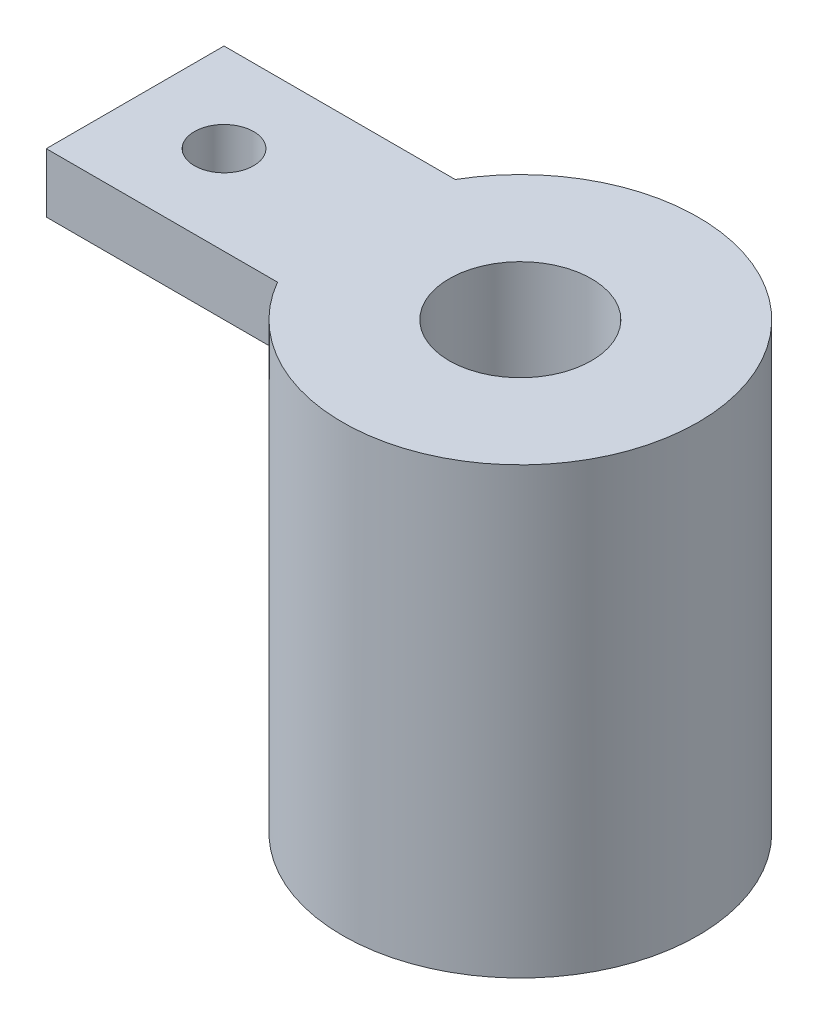
ISO-10303-21;
HEADER;
FILE_DESCRIPTION(('STEP AP214'),'2;1');
FILE_NAME('part.step','',(''),(''),'','','');
FILE_SCHEMA(('AUTOMOTIVE_DESIGN { 1 0 10303 214 1 1 1 1 }'));
ENDSEC;
DATA;
#1=APPLICATION_CONTEXT('core data for automotive mechanical design processes');
#2=APPLICATION_PROTOCOL_DEFINITION('international standard','automotive_design',2000,#1);
#3=PRODUCT_CONTEXT('',#1,'mechanical');
#4=PRODUCT('Part','Part','',(#3));
#5=PRODUCT_RELATED_PRODUCT_CATEGORY('part','',(#4));
#6=PRODUCT_DEFINITION_FORMATION('','',#4);
#7=PRODUCT_DEFINITION_CONTEXT('part definition',#1,'design');
#8=PRODUCT_DEFINITION('design','',#6,#7);
#9=PRODUCT_DEFINITION_SHAPE('','',#8);
#10=(LENGTH_UNIT() NAMED_UNIT(*) SI_UNIT(.MILLI.,.METRE.));
#11=(NAMED_UNIT(*) PLANE_ANGLE_UNIT() SI_UNIT($,.RADIAN.));
#12=(NAMED_UNIT(*) SI_UNIT($,.STERADIAN.) SOLID_ANGLE_UNIT());
#13=UNCERTAINTY_MEASURE_WITH_UNIT(LENGTH_MEASURE(1.E-05),#10,'distance_accuracy_value','');
#14=(GEOMETRIC_REPRESENTATION_CONTEXT(3) GLOBAL_UNCERTAINTY_ASSIGNED_CONTEXT((#13)) GLOBAL_UNIT_ASSIGNED_CONTEXT((#10,
#11,#12)) REPRESENTATION_CONTEXT('',''));
#15=CARTESIAN_POINT('',(0.,0.,0.));
#16=DIRECTION('',(0.,0.,1.));
#17=DIRECTION('',(1.,0.,0.));
#18=AXIS2_PLACEMENT_3D('',#15,#16,#17);
#19=CARTESIAN_POINT('',(0.,12.7,0.));
#20=DIRECTION('',(0.,1.,0.));
#21=DIRECTION('',(0.,0.,1.));
#22=AXIS2_PLACEMENT_3D('',#19,#20,#21);
#23=PLANE('',#22);
#24=CARTESIAN_POINT('',(0.,12.7,0.));
#25=DIRECTION('',(0.,1.,0.));
#26=DIRECTION('',(0.,0.,1.));
#27=AXIS2_PLACEMENT_3D('',#24,#25,#26);
#28=CIRCLE('',#27,9.525);
#29=CARTESIAN_POINT('',(0.,12.7,9.525));
#30=VERTEX_POINT('',#29);
#31=EDGE_CURVE('E175',#30,#30,#28,.T.);
#32=ORIENTED_EDGE('',*,*,#31,.F.);
#33=EDGE_LOOP('',(#32));
#34=FACE_BOUND('',#33,.T.);
#35=DIRECTION('',(0.,0.,-1.));
#36=VECTOR('',#35,1.);
#37=CARTESIAN_POINT('',(-1.016,12.7,6.35));
#38=LINE('',#37,#36);
#39=CARTESIAN_POINT('',(-1.016,12.7,6.35));
#40=VERTEX_POINT('',#39);
#41=CARTESIAN_POINT('',(-1.016,12.7,-6.35));
#42=VERTEX_POINT('',#41);
#43=EDGE_CURVE('E137',#40,#42,#38,.T.);
#44=ORIENTED_EDGE('',*,*,#43,.F.);
#45=DIRECTION('',(-1.,0.,0.));
#46=VECTOR('',#45,1.);
#47=CARTESIAN_POINT('',(-1.016,12.7,6.35));
#48=LINE('',#47,#46);
#49=CARTESIAN_POINT('',(1.016,12.7,6.35));
#50=VERTEX_POINT('',#49);
#51=EDGE_CURVE('E145',#50,#40,#48,.T.);
#52=ORIENTED_EDGE('',*,*,#51,.F.);
#53=DIRECTION('',(0.,0.,1.));
#54=VECTOR('',#53,1.);
#55=CARTESIAN_POINT('',(1.016,12.7,6.35));
#56=LINE('',#55,#54);
#57=CARTESIAN_POINT('',(1.016,12.7,-6.35));
#58=VERTEX_POINT('',#57);
#59=EDGE_CURVE('E155',#58,#50,#56,.T.);
#60=ORIENTED_EDGE('',*,*,#59,.F.);
#61=DIRECTION('',(1.,0.,0.));
#62=VECTOR('',#61,1.);
#63=CARTESIAN_POINT('',(-1.016,12.7,-6.35));
#64=LINE('',#63,#62);
#65=EDGE_CURVE('E56',#42,#58,#64,.T.);
#66=ORIENTED_EDGE('',*,*,#65,.F.);
#67=EDGE_LOOP('',(#44,#52,#60,#66));
#68=FACE_BOUND('',#67,.T.);
#69=ADVANCED_FACE('F33',(#34,#68),#23,.F.);
#70=CARTESIAN_POINT('',(0.,0.,0.));
#71=DIRECTION('',(0.,1.,0.));
#72=DIRECTION('',(0.,0.,1.));
#73=AXIS2_PLACEMENT_3D('',#70,#71,#72);
#74=PLANE('',#73);
#75=CARTESIAN_POINT('',(0.,0.,0.));
#76=DIRECTION('',(0.,1.,0.));
#77=DIRECTION('',(0.,0.,1.));
#78=AXIS2_PLACEMENT_3D('',#75,#76,#77);
#79=CIRCLE('',#78,15.24);
#80=CARTESIAN_POINT('',(0.,0.,15.24));
#81=VERTEX_POINT('',#80);
#82=EDGE_CURVE('E41',#81,#81,#79,.T.);
#83=ORIENTED_EDGE('',*,*,#82,.F.);
#84=EDGE_LOOP('',(#83));
#85=FACE_BOUND('',#84,.T.);
#86=CARTESIAN_POINT('',(0.,0.,0.));
#87=DIRECTION('',(0.,1.,0.));
#88=DIRECTION('',(0.,0.,1.));
#89=AXIS2_PLACEMENT_3D('',#86,#87,#88);
#90=CIRCLE('',#89,9.525);
#91=CARTESIAN_POINT('',(0.,0.,9.525));
#92=VERTEX_POINT('',#91);
#93=EDGE_CURVE('E178',#92,#92,#90,.T.);
#94=ORIENTED_EDGE('',*,*,#93,.T.);
#95=EDGE_LOOP('',(#94));
#96=FACE_BOUND('',#95,.T.);
#97=ADVANCED_FACE('F183',(#85,#96),#74,.F.);
#98=CARTESIAN_POINT('',(0.,12.7,0.));
#99=DIRECTION('',(0.,-1.,0.));
#100=DIRECTION('',(0.,0.,-1.));
#101=AXIS2_PLACEMENT_3D('',#98,#99,#100);
#102=CYLINDRICAL_SURFACE('',#101,15.24);
#103=CARTESIAN_POINT('',(0.,38.1,0.));
#104=DIRECTION('',(0.,1.,0.));
#105=DIRECTION('',(0.,0.,1.));
#106=AXIS2_PLACEMENT_3D('',#103,#104,#105);
#107=CIRCLE('',#106,15.24);
#108=CARTESIAN_POINT('',(-13.1982271536748,38.1,7.62));
#109=VERTEX_POINT('',#108);
#110=CARTESIAN_POINT('',(-13.1982271536748,38.1,-7.62));
#111=VERTEX_POINT('',#110);
#112=EDGE_CURVE('E173',#109,#111,#107,.T.);
#113=ORIENTED_EDGE('',*,*,#112,.F.);
#114=DIRECTION('',(0.,1.,0.));
#115=VECTOR('',#114,1.);
#116=CARTESIAN_POINT('',(-13.1982271536748,33.02,7.62));
#117=LINE('',#116,#115);
#118=CARTESIAN_POINT('',(-13.1982271536748,33.02,7.62));
#119=VERTEX_POINT('',#118);
#120=EDGE_CURVE('E123',#119,#109,#117,.T.);
#121=ORIENTED_EDGE('',*,*,#120,.F.);
#122=CARTESIAN_POINT('',(0.,33.02,0.));
#123=DIRECTION('',(0.,-1.,0.));
#124=DIRECTION('',(0.,0.,1.));
#125=AXIS2_PLACEMENT_3D('',#122,#123,#124);
#126=CIRCLE('',#125,15.24);
#127=CARTESIAN_POINT('',(-13.1982271536748,33.02,-7.62));
#128=VERTEX_POINT('',#127);
#129=EDGE_CURVE('E116',#119,#128,#126,.T.);
#130=ORIENTED_EDGE('',*,*,#129,.T.);
#131=DIRECTION('',(0.,1.,0.));
#132=VECTOR('',#131,1.);
#133=CARTESIAN_POINT('',(-13.1982271536748,33.02,-7.62));
#134=LINE('',#133,#132);
#135=EDGE_CURVE('E100',#128,#111,#134,.T.);
#136=ORIENTED_EDGE('',*,*,#135,.T.);
#137=EDGE_LOOP('',(#113,#121,#130,#136));
#138=FACE_BOUND('',#137,.T.);
#139=ORIENTED_EDGE('',*,*,#82,.T.);
#140=EDGE_LOOP('',(#139));
#141=FACE_BOUND('',#140,.T.);
#142=ADVANCED_FACE('F35',(#138,#141),#102,.T.);
#143=CARTESIAN_POINT('',(0.,12.7,0.));
#144=DIRECTION('',(0.,-1.,0.));
#145=DIRECTION('',(0.,0.,-1.));
#146=AXIS2_PLACEMENT_3D('',#143,#144,#145);
#147=CYLINDRICAL_SURFACE('',#146,9.525);
#148=ORIENTED_EDGE('',*,*,#31,.T.);
#149=EDGE_LOOP('',(#148));
#150=FACE_BOUND('',#149,.T.);
#151=ORIENTED_EDGE('',*,*,#93,.F.);
#152=EDGE_LOOP('',(#151));
#153=FACE_BOUND('',#152,.T.);
#154=ADVANCED_FACE('F188',(#150,#153),#147,.F.);
#155=CARTESIAN_POINT('',(0.,38.1,0.));
#156=DIRECTION('',(0.,1.,0.));
#157=DIRECTION('',(0.,0.,1.));
#158=AXIS2_PLACEMENT_3D('',#155,#156,#157);
#159=PLANE('',#158);
#160=CARTESIAN_POINT('',(-25.4,38.1,0.));
#161=DIRECTION('',(0.,1.,0.));
#162=DIRECTION('',(0.,0.,1.));
#163=AXIS2_PLACEMENT_3D('',#160,#161,#162);
#164=CIRCLE('',#163,2.54);
#165=CARTESIAN_POINT('',(-25.4,38.1,2.54));
#166=VERTEX_POINT('',#165);
#167=EDGE_CURVE('E128',#166,#166,#164,.T.);
#168=ORIENTED_EDGE('',*,*,#167,.F.);
#169=EDGE_LOOP('',(#168));
#170=FACE_BOUND('',#169,.T.);
#171=ORIENTED_EDGE('',*,*,#112,.T.);
#172=DIRECTION('',(-1.,0.,0.));
#173=VECTOR('',#172,1.);
#174=CARTESIAN_POINT('',(-13.1982271536748,38.1,-7.62));
#175=LINE('',#174,#173);
#176=CARTESIAN_POINT('',(-33.02,38.1,-7.61999999999999));
#177=VERTEX_POINT('',#176);
#178=EDGE_CURVE('E105',#111,#177,#175,.T.);
#179=ORIENTED_EDGE('',*,*,#178,.T.);
#180=DIRECTION('',(0.,0.,1.));
#181=VECTOR('',#180,1.);
#182=CARTESIAN_POINT('',(-33.02,38.1,-7.61999999999999));
#183=LINE('',#182,#181);
#184=CARTESIAN_POINT('',(-33.02,38.1,7.62));
#185=VERTEX_POINT('',#184);
#186=EDGE_CURVE('E125',#177,#185,#183,.T.);
#187=ORIENTED_EDGE('',*,*,#186,.T.);
#188=DIRECTION('',(1.,0.,0.));
#189=VECTOR('',#188,1.);
#190=CARTESIAN_POINT('',(-33.02,38.1,7.62));
#191=LINE('',#190,#189);
#192=EDGE_CURVE('E48',#185,#109,#191,.T.);
#193=ORIENTED_EDGE('',*,*,#192,.T.);
#194=EDGE_LOOP('',(#171,#179,#187,#193));
#195=FACE_BOUND('',#194,.T.);
#196=CARTESIAN_POINT('',(0.,38.1,0.));
#197=DIRECTION('',(0.,1.,0.));
#198=DIRECTION('',(0.,0.,1.));
#199=AXIS2_PLACEMENT_3D('',#196,#197,#198);
#200=CIRCLE('',#199,6.096);
#201=CARTESIAN_POINT('',(0.,38.1,6.096));
#202=VERTEX_POINT('',#201);
#203=EDGE_CURVE('E170',#202,#202,#200,.T.);
#204=ORIENTED_EDGE('',*,*,#203,.F.);
#205=EDGE_LOOP('',(#204));
#206=FACE_BOUND('',#205,.T.);
#207=ADVANCED_FACE('F190',(#170,#195,#206),#159,.T.);
#208=CARTESIAN_POINT('',(0.,38.1,0.));
#209=DIRECTION('',(0.,-1.,0.));
#210=DIRECTION('',(0.,0.,-1.));
#211=AXIS2_PLACEMENT_3D('',#208,#209,#210);
#212=CYLINDRICAL_SURFACE('',#211,6.096);
#213=ORIENTED_EDGE('',*,*,#203,.T.);
#214=EDGE_LOOP('',(#213));
#215=FACE_BOUND('',#214,.T.);
#216=CARTESIAN_POINT('',(0.,25.4,0.));
#217=DIRECTION('',(0.,1.,0.));
#218=DIRECTION('',(0.,0.,1.));
#219=AXIS2_PLACEMENT_3D('',#216,#217,#218);
#220=CIRCLE('',#219,6.096);
#221=CARTESIAN_POINT('',(0.,25.4,6.096));
#222=VERTEX_POINT('',#221);
#223=EDGE_CURVE('E11',#222,#222,#220,.F.);
#224=ORIENTED_EDGE('',*,*,#223,.T.);
#225=EDGE_LOOP('',(#224));
#226=FACE_BOUND('',#225,.T.);
#227=ADVANCED_FACE('F198',(#215,#226),#212,.F.);
#228=CARTESIAN_POINT('',(0.,25.4,0.));
#229=DIRECTION('',(0.,1.,0.));
#230=DIRECTION('',(0.,0.,1.));
#231=AXIS2_PLACEMENT_3D('',#228,#229,#230);
#232=PLANE('',#231);
#233=ORIENTED_EDGE('',*,*,#223,.F.);
#234=EDGE_LOOP('',(#233));
#235=FACE_BOUND('',#234,.T.);
#236=ADVANCED_FACE('F209',(#235),#232,.T.);
#237=CARTESIAN_POINT('',(-1.016,0.,6.35));
#238=DIRECTION('',(1.,0.,0.));
#239=DIRECTION('',(0.,0.,-1.));
#240=AXIS2_PLACEMENT_3D('',#237,#238,#239);
#241=PLANE('',#240);
#242=ORIENTED_EDGE('',*,*,#43,.T.);
#243=DIRECTION('',(0.,1.,0.));
#244=VECTOR('',#243,1.);
#245=CARTESIAN_POINT('',(-1.016,0.,-6.35));
#246=LINE('',#245,#244);
#247=CARTESIAN_POINT('',(-1.016,0.,-6.35));
#248=VERTEX_POINT('',#247);
#249=EDGE_CURVE('E168',#248,#42,#246,.T.);
#250=ORIENTED_EDGE('',*,*,#249,.F.);
#251=DIRECTION('',(0.,0.,-1.));
#252=VECTOR('',#251,1.);
#253=CARTESIAN_POINT('',(-1.016,0.,6.35));
#254=LINE('',#253,#252);
#255=CARTESIAN_POINT('',(-1.016,0.,6.35));
#256=VERTEX_POINT('',#255);
#257=EDGE_CURVE('E141',#256,#248,#254,.T.);
#258=ORIENTED_EDGE('',*,*,#257,.F.);
#259=DIRECTION('',(0.,1.,0.));
#260=VECTOR('',#259,1.);
#261=CARTESIAN_POINT('',(-1.016,0.,6.35));
#262=LINE('',#261,#260);
#263=EDGE_CURVE('E151',#256,#40,#262,.T.);
#264=ORIENTED_EDGE('',*,*,#263,.T.);
#265=EDGE_LOOP('',(#242,#250,#258,#264));
#266=FACE_BOUND('',#265,.T.);
#267=ADVANCED_FACE('F211',(#266),#241,.F.);
#268=CARTESIAN_POINT('',(-1.016,0.,-6.35));
#269=DIRECTION('',(0.,0.,1.));
#270=DIRECTION('',(1.,0.,0.));
#271=AXIS2_PLACEMENT_3D('',#268,#269,#270);
#272=PLANE('',#271);
#273=ORIENTED_EDGE('',*,*,#65,.T.);
#274=DIRECTION('',(0.,1.,0.));
#275=VECTOR('',#274,1.);
#276=CARTESIAN_POINT('',(1.016,0.,-6.35));
#277=LINE('',#276,#275);
#278=CARTESIAN_POINT('',(1.016,0.,-6.35));
#279=VERTEX_POINT('',#278);
#280=EDGE_CURVE('E165',#279,#58,#277,.T.);
#281=ORIENTED_EDGE('',*,*,#280,.F.);
#282=DIRECTION('',(1.,0.,0.));
#283=VECTOR('',#282,1.);
#284=CARTESIAN_POINT('',(-1.016,0.,-6.35));
#285=LINE('',#284,#283);
#286=EDGE_CURVE('E144',#248,#279,#285,.T.);
#287=ORIENTED_EDGE('',*,*,#286,.F.);
#288=ORIENTED_EDGE('',*,*,#249,.T.);
#289=EDGE_LOOP('',(#273,#281,#287,#288));
#290=FACE_BOUND('',#289,.T.);
#291=ADVANCED_FACE('F218',(#290),#272,.F.);
#292=CARTESIAN_POINT('',(1.016,0.,6.35));
#293=DIRECTION('',(-1.,0.,0.));
#294=DIRECTION('',(0.,0.,1.));
#295=AXIS2_PLACEMENT_3D('',#292,#293,#294);
#296=PLANE('',#295);
#297=ORIENTED_EDGE('',*,*,#59,.T.);
#298=DIRECTION('',(0.,1.,0.));
#299=VECTOR('',#298,1.);
#300=CARTESIAN_POINT('',(1.016,0.,6.35));
#301=LINE('',#300,#299);
#302=CARTESIAN_POINT('',(1.016,0.,6.35));
#303=VERTEX_POINT('',#302);
#304=EDGE_CURVE('E162',#303,#50,#301,.T.);
#305=ORIENTED_EDGE('',*,*,#304,.F.);
#306=DIRECTION('',(0.,0.,1.));
#307=VECTOR('',#306,1.);
#308=CARTESIAN_POINT('',(1.016,0.,6.35));
#309=LINE('',#308,#307);
#310=EDGE_CURVE('E147',#279,#303,#309,.T.);
#311=ORIENTED_EDGE('',*,*,#310,.F.);
#312=ORIENTED_EDGE('',*,*,#280,.T.);
#313=EDGE_LOOP('',(#297,#305,#311,#312));
#314=FACE_BOUND('',#313,.T.);
#315=ADVANCED_FACE('F222',(#314),#296,.F.);
#316=CARTESIAN_POINT('',(-1.016,0.,6.35));
#317=DIRECTION('',(0.,0.,-1.));
#318=DIRECTION('',(-1.,0.,0.));
#319=AXIS2_PLACEMENT_3D('',#316,#317,#318);
#320=PLANE('',#319);
#321=ORIENTED_EDGE('',*,*,#51,.T.);
#322=ORIENTED_EDGE('',*,*,#263,.F.);
#323=DIRECTION('',(-1.,0.,0.));
#324=VECTOR('',#323,1.);
#325=CARTESIAN_POINT('',(-1.016,0.,6.35));
#326=LINE('',#325,#324);
#327=EDGE_CURVE('E149',#303,#256,#326,.T.);
#328=ORIENTED_EDGE('',*,*,#327,.F.);
#329=ORIENTED_EDGE('',*,*,#304,.T.);
#330=EDGE_LOOP('',(#321,#322,#328,#329));
#331=FACE_BOUND('',#330,.T.);
#332=ADVANCED_FACE('F226',(#331),#320,.F.);
#333=CARTESIAN_POINT('',(0.,0.,0.));
#334=DIRECTION('',(0.,-1.,0.));
#335=DIRECTION('',(0.,0.,-1.));
#336=AXIS2_PLACEMENT_3D('',#333,#334,#335);
#337=PLANE('',#336);
#338=ORIENTED_EDGE('',*,*,#257,.T.);
#339=ORIENTED_EDGE('',*,*,#286,.T.);
#340=ORIENTED_EDGE('',*,*,#310,.T.);
#341=ORIENTED_EDGE('',*,*,#327,.T.);
#342=EDGE_LOOP('',(#338,#339,#340,#341));
#343=FACE_BOUND('',#342,.T.);
#344=ADVANCED_FACE('F230',(#343),#337,.T.);
#345=CARTESIAN_POINT('',(-33.02,33.02,7.62));
#346=DIRECTION('',(0.,0.,1.));
#347=DIRECTION('',(1.,0.,0.));
#348=AXIS2_PLACEMENT_3D('',#345,#346,#347);
#349=PLANE('',#348);
#350=ORIENTED_EDGE('',*,*,#192,.F.);
#351=DIRECTION('',(0.,1.,0.));
#352=VECTOR('',#351,1.);
#353=CARTESIAN_POINT('',(-33.02,33.02,7.62));
#354=LINE('',#353,#352);
#355=CARTESIAN_POINT('',(-33.02,33.02,7.62));
#356=VERTEX_POINT('',#355);
#357=EDGE_CURVE('E138',#356,#185,#354,.T.);
#358=ORIENTED_EDGE('',*,*,#357,.F.);
#359=DIRECTION('',(1.,0.,0.));
#360=VECTOR('',#359,1.);
#361=CARTESIAN_POINT('',(-33.02,33.02,7.62));
#362=LINE('',#361,#360);
#363=EDGE_CURVE('E110',#356,#119,#362,.T.);
#364=ORIENTED_EDGE('',*,*,#363,.T.);
#365=ORIENTED_EDGE('',*,*,#120,.T.);
#366=EDGE_LOOP('',(#350,#358,#364,#365));
#367=FACE_BOUND('',#366,.T.);
#368=ADVANCED_FACE('F234',(#367),#349,.T.);
#369=CARTESIAN_POINT('',(-33.02,33.02,-7.61999999999999));
#370=DIRECTION('',(-1.,0.,0.));
#371=DIRECTION('',(0.,0.,1.));
#372=AXIS2_PLACEMENT_3D('',#369,#370,#371);
#373=PLANE('',#372);
#374=ORIENTED_EDGE('',*,*,#186,.F.);
#375=DIRECTION('',(0.,1.,0.));
#376=VECTOR('',#375,1.);
#377=CARTESIAN_POINT('',(-33.02,33.02,-7.61999999999999));
#378=LINE('',#377,#376);
#379=CARTESIAN_POINT('',(-33.02,33.02,-7.61999999999999));
#380=VERTEX_POINT('',#379);
#381=EDGE_CURVE('E109',#380,#177,#378,.T.);
#382=ORIENTED_EDGE('',*,*,#381,.F.);
#383=DIRECTION('',(0.,0.,1.));
#384=VECTOR('',#383,1.);
#385=CARTESIAN_POINT('',(-33.02,33.02,-7.61999999999999));
#386=LINE('',#385,#384);
#387=EDGE_CURVE('E119',#380,#356,#386,.T.);
#388=ORIENTED_EDGE('',*,*,#387,.T.);
#389=ORIENTED_EDGE('',*,*,#357,.T.);
#390=EDGE_LOOP('',(#374,#382,#388,#389));
#391=FACE_BOUND('',#390,.T.);
#392=ADVANCED_FACE('F238',(#391),#373,.T.);
#393=CARTESIAN_POINT('',(-13.1982271536748,33.02,-7.62));
#394=DIRECTION('',(0.,0.,-1.));
#395=DIRECTION('',(-1.,0.,0.));
#396=AXIS2_PLACEMENT_3D('',#393,#394,#395);
#397=PLANE('',#396);
#398=ORIENTED_EDGE('',*,*,#178,.F.);
#399=ORIENTED_EDGE('',*,*,#135,.F.);
#400=DIRECTION('',(-1.,0.,0.));
#401=VECTOR('',#400,1.);
#402=CARTESIAN_POINT('',(-13.1982271536748,33.02,-7.62));
#403=LINE('',#402,#401);
#404=EDGE_CURVE('E103',#128,#380,#403,.T.);
#405=ORIENTED_EDGE('',*,*,#404,.T.);
#406=ORIENTED_EDGE('',*,*,#381,.T.);
#407=EDGE_LOOP('',(#398,#399,#405,#406));
#408=FACE_BOUND('',#407,.T.);
#409=ADVANCED_FACE('F102',(#408),#397,.T.);
#410=CARTESIAN_POINT('',(0.,33.02,0.));
#411=DIRECTION('',(0.,1.,0.));
#412=DIRECTION('',(0.,0.,1.));
#413=AXIS2_PLACEMENT_3D('',#410,#411,#412);
#414=PLANE('',#413);
#415=CARTESIAN_POINT('',(-25.4,33.02,0.));
#416=DIRECTION('',(0.,1.,0.));
#417=DIRECTION('',(0.,0.,1.));
#418=AXIS2_PLACEMENT_3D('',#415,#416,#417);
#419=CIRCLE('',#418,2.54);
#420=CARTESIAN_POINT('',(-25.4,33.02,2.54));
#421=VERTEX_POINT('',#420);
#422=EDGE_CURVE('E134',#421,#421,#419,.T.);
#423=ORIENTED_EDGE('',*,*,#422,.T.);
#424=EDGE_LOOP('',(#423));
#425=FACE_BOUND('',#424,.T.);
#426=ORIENTED_EDGE('',*,*,#129,.F.);
#427=ORIENTED_EDGE('',*,*,#363,.F.);
#428=ORIENTED_EDGE('',*,*,#387,.F.);
#429=ORIENTED_EDGE('',*,*,#404,.F.);
#430=EDGE_LOOP('',(#426,#427,#428,#429));
#431=FACE_BOUND('',#430,.T.);
#432=ADVANCED_FACE('F114',(#425,#431),#414,.F.);
#433=CARTESIAN_POINT('',(-25.4,33.02,0.));
#434=DIRECTION('',(0.,1.,0.));
#435=DIRECTION('',(0.,0.,1.));
#436=AXIS2_PLACEMENT_3D('',#433,#434,#435);
#437=CYLINDRICAL_SURFACE('',#436,2.54);
#438=ORIENTED_EDGE('',*,*,#422,.F.);
#439=EDGE_LOOP('',(#438));
#440=FACE_BOUND('',#439,.T.);
#441=ORIENTED_EDGE('',*,*,#167,.T.);
#442=EDGE_LOOP('',(#441));
#443=FACE_BOUND('',#442,.T.);
#444=ADVANCED_FACE('F247',(#440,#443),#437,.F.);
#445=CLOSED_SHELL('',(#69,#97,#142,#154,#207,#227,#236,#267,#291,#315,#332,#344,#368,#392,#409,
#432,#444));
#446=MANIFOLD_SOLID_BREP('B2',#445);
#447=ADVANCED_BREP_SHAPE_REPRESENTATION('',(#18,#446),#14);
#448=SHAPE_DEFINITION_REPRESENTATION(#9,#447);
ENDSEC;
END-ISO-10303-21;
